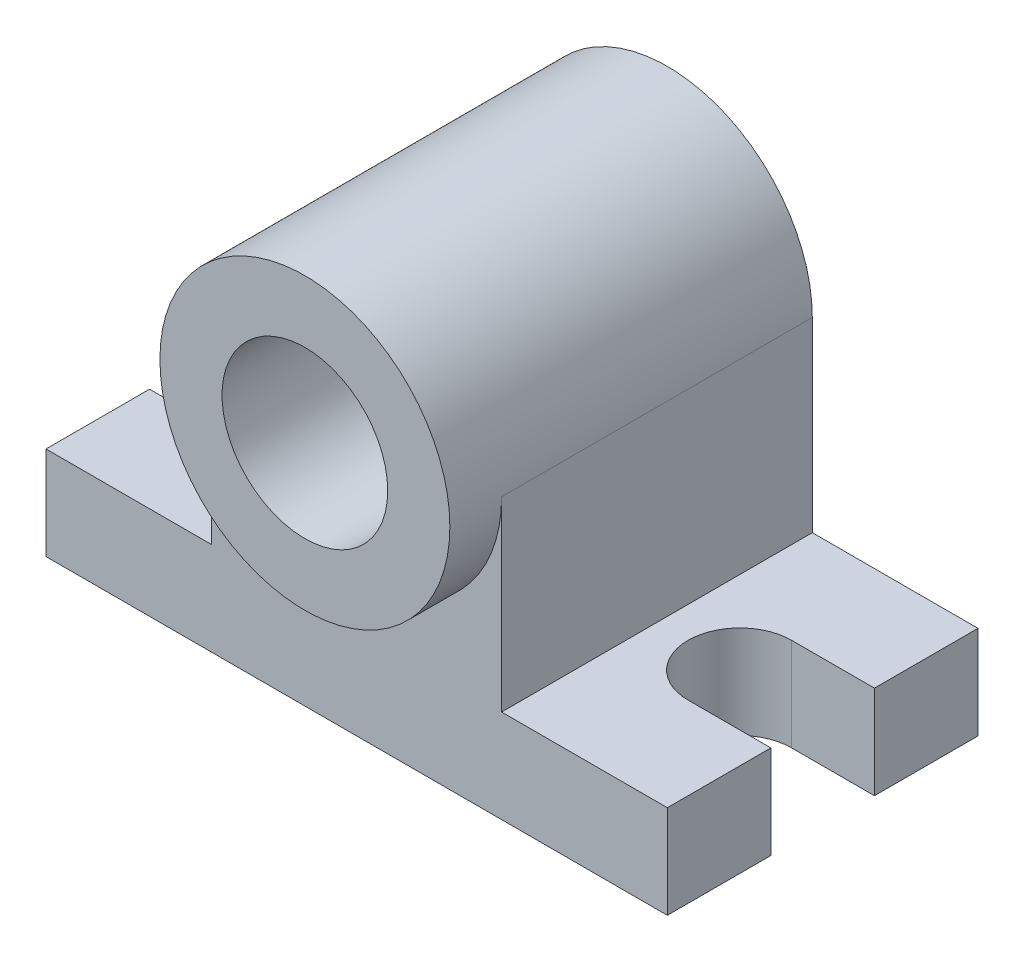
ISO-10303-21;
HEADER;
FILE_DESCRIPTION(('STEP AP214'),'2;1');
FILE_NAME('part.step','',(''),(''),'','','');
FILE_SCHEMA(('AUTOMOTIVE_DESIGN { 1 0 10303 214 1 1 1 1 }'));
ENDSEC;
DATA;
#1=APPLICATION_CONTEXT('core data for automotive mechanical design processes');
#2=APPLICATION_PROTOCOL_DEFINITION('international standard','automotive_design',2000,#1);
#3=PRODUCT_CONTEXT('',#1,'mechanical');
#4=PRODUCT('Part','Part','',(#3));
#5=PRODUCT_RELATED_PRODUCT_CATEGORY('part','',(#4));
#6=PRODUCT_DEFINITION_FORMATION('','',#4);
#7=PRODUCT_DEFINITION_CONTEXT('part definition',#1,'design');
#8=PRODUCT_DEFINITION('design','',#6,#7);
#9=PRODUCT_DEFINITION_SHAPE('','',#8);
#10=(LENGTH_UNIT() NAMED_UNIT(*) SI_UNIT(.MILLI.,.METRE.));
#11=(NAMED_UNIT(*) PLANE_ANGLE_UNIT() SI_UNIT($,.RADIAN.));
#12=(NAMED_UNIT(*) SI_UNIT($,.STERADIAN.) SOLID_ANGLE_UNIT());
#13=UNCERTAINTY_MEASURE_WITH_UNIT(LENGTH_MEASURE(1.E-05),#10,'distance_accuracy_value','');
#14=(GEOMETRIC_REPRESENTATION_CONTEXT(3) GLOBAL_UNCERTAINTY_ASSIGNED_CONTEXT((#13)) GLOBAL_UNIT_ASSIGNED_CONTEXT((#10,
#11,#12)) REPRESENTATION_CONTEXT('',''));
#15=CARTESIAN_POINT('',(0.,0.,0.));
#16=DIRECTION('',(0.,0.,1.));
#17=DIRECTION('',(1.,0.,0.));
#18=AXIS2_PLACEMENT_3D('',#15,#16,#17);
#19=CARTESIAN_POINT('',(30.0000000000001,0.,-30.));
#20=DIRECTION('',(1.,0.,0.));
#21=DIRECTION('',(0.,0.,-1.));
#22=AXIS2_PLACEMENT_3D('',#19,#20,#21);
#23=PLANE('',#22);
#24=DIRECTION('',(0.,1.,0.));
#25=VECTOR('',#24,1.);
#26=CARTESIAN_POINT('',(30.0000000000001,-27.,-20.));
#27=LINE('',#26,#25);
#28=CARTESIAN_POINT('',(30.0000000000001,-27.,-20.));
#29=VERTEX_POINT('',#28);
#30=CARTESIAN_POINT('',(30.0000000000001,-18.,-20.));
#31=VERTEX_POINT('',#30);
#32=EDGE_CURVE('E201',#29,#31,#27,.T.);
#33=ORIENTED_EDGE('',*,*,#32,.F.);
#34=DIRECTION('',(0.,0.,1.));
#35=VECTOR('',#34,1.);
#36=CARTESIAN_POINT('',(30.0000000000001,-27.,-30.));
#37=LINE('',#36,#35);
#38=CARTESIAN_POINT('',(30.0000000000001,-27.,-30.));
#39=VERTEX_POINT('',#38);
#40=EDGE_CURVE('E318',#39,#29,#37,.T.);
#41=ORIENTED_EDGE('',*,*,#40,.F.);
#42=DIRECTION('',(0.,1.,0.));
#43=VECTOR('',#42,1.);
#44=CARTESIAN_POINT('',(30.0000000000001,0.,-30.));
#45=LINE('',#44,#43);
#46=CARTESIAN_POINT('',(30.0000000000001,-18.,-30.));
#47=VERTEX_POINT('',#46);
#48=EDGE_CURVE('E267',#39,#47,#45,.T.);
#49=ORIENTED_EDGE('',*,*,#48,.T.);
#50=DIRECTION('',(0.,0.,1.));
#51=VECTOR('',#50,1.);
#52=CARTESIAN_POINT('',(30.0000000000001,-18.,-30.));
#53=LINE('',#52,#51);
#54=EDGE_CURVE('E313',#47,#31,#53,.T.);
#55=ORIENTED_EDGE('',*,*,#54,.T.);
#56=EDGE_LOOP('',(#33,#41,#49,#55));
#57=FACE_BOUND('',#56,.T.);
#58=ADVANCED_FACE('F47',(#57),#23,.T.);
#59=CARTESIAN_POINT('',(-30.,0.,-30.));
#60=DIRECTION('',(1.,0.,0.));
#61=DIRECTION('',(0.,1.,0.));
#62=AXIS2_PLACEMENT_3D('',#59,#60,#61);
#63=PLANE('',#62);
#64=DIRECTION('',(0.,0.,1.));
#65=VECTOR('',#64,1.);
#66=CARTESIAN_POINT('',(-29.9999999999999,-18.,-30.));
#67=LINE('',#66,#65);
#68=CARTESIAN_POINT('',(-29.9999999999999,-18.,-9.99999999999999));
#69=VERTEX_POINT('',#68);
#70=CARTESIAN_POINT('',(-29.9999999999999,-18.,0.));
#71=VERTEX_POINT('',#70);
#72=EDGE_CURVE('E330',#69,#71,#67,.T.);
#73=ORIENTED_EDGE('',*,*,#72,.F.);
#74=DIRECTION('',(0.,1.,0.));
#75=VECTOR('',#74,1.);
#76=CARTESIAN_POINT('',(-29.9999999999999,-27.,-9.99999999999999));
#77=LINE('',#76,#75);
#78=CARTESIAN_POINT('',(-29.9999999999999,-27.,-9.99999999999999));
#79=VERTEX_POINT('',#78);
#80=EDGE_CURVE('E214',#79,#69,#77,.T.);
#81=ORIENTED_EDGE('',*,*,#80,.F.);
#82=DIRECTION('',(0.,0.,1.));
#83=VECTOR('',#82,1.);
#84=CARTESIAN_POINT('',(-29.9999999999999,-27.,-30.));
#85=LINE('',#84,#83);
#86=CARTESIAN_POINT('',(-29.9999999999999,-27.,0.));
#87=VERTEX_POINT('',#86);
#88=EDGE_CURVE('E326',#79,#87,#85,.T.);
#89=ORIENTED_EDGE('',*,*,#88,.T.);
#90=DIRECTION('',(0.,1.,0.));
#91=VECTOR('',#90,1.);
#92=CARTESIAN_POINT('',(-30.,0.,0.));
#93=LINE('',#92,#91);
#94=EDGE_CURVE('E288',#87,#71,#93,.T.);
#95=ORIENTED_EDGE('',*,*,#94,.T.);
#96=EDGE_LOOP('',(#73,#81,#89,#95));
#97=FACE_BOUND('',#96,.T.);
#98=ADVANCED_FACE('F367',(#97),#63,.F.);
#99=CARTESIAN_POINT('',(0.,0.,-30.));
#100=DIRECTION('',(0.,0.,1.));
#101=DIRECTION('',(1.,0.,0.));
#102=AXIS2_PLACEMENT_3D('',#99,#100,#101);
#103=CYLINDRICAL_SURFACE('',#102,14.);
#104=DIRECTION('',(0.,0.,1.));
#105=VECTOR('',#104,1.);
#106=CARTESIAN_POINT('',(-14.,0.,-30.));
#107=LINE('',#106,#105);
#108=CARTESIAN_POINT('',(-14.,0.,-30.));
#109=VERTEX_POINT('',#108);
#110=CARTESIAN_POINT('',(-14.,0.,0.));
#111=VERTEX_POINT('',#110);
#112=EDGE_CURVE('E51',#109,#111,#107,.T.);
#113=ORIENTED_EDGE('',*,*,#112,.T.);
#114=CARTESIAN_POINT('',(0.,0.,0.));
#115=DIRECTION('',(0.,0.,1.));
#116=DIRECTION('',(1.,0.,0.));
#117=AXIS2_PLACEMENT_3D('',#114,#115,#116);
#118=CIRCLE('',#117,14.);
#119=CARTESIAN_POINT('',(14.,0.,0.));
#120=VERTEX_POINT('',#119);
#121=EDGE_CURVE('E11',#111,#120,#118,.T.);
#122=ORIENTED_EDGE('',*,*,#121,.T.);
#123=DIRECTION('',(0.,0.,1.));
#124=VECTOR('',#123,1.);
#125=CARTESIAN_POINT('',(14.,0.,-30.));
#126=LINE('',#125,#124);
#127=CARTESIAN_POINT('',(14.,0.,-30.));
#128=VERTEX_POINT('',#127);
#129=EDGE_CURVE('E57',#128,#120,#126,.T.);
#130=ORIENTED_EDGE('',*,*,#129,.F.);
#131=CARTESIAN_POINT('',(0.,0.,-30.));
#132=DIRECTION('',(0.,0.,1.));
#133=DIRECTION('',(1.,0.,0.));
#134=AXIS2_PLACEMENT_3D('',#131,#132,#133);
#135=CIRCLE('',#134,14.);
#136=EDGE_CURVE('E248',#128,#109,#135,.T.);
#137=ORIENTED_EDGE('',*,*,#136,.T.);
#138=EDGE_LOOP('',(#113,#122,#130,#137));
#139=FACE_BOUND('',#138,.T.);
#140=CARTESIAN_POINT('',(0.,0.,5.));
#141=DIRECTION('',(0.,0.,1.));
#142=DIRECTION('',(1.,0.,0.));
#143=AXIS2_PLACEMENT_3D('',#140,#141,#142);
#144=CIRCLE('',#143,14.);
#145=CARTESIAN_POINT('',(14.,0.,5.));
#146=VERTEX_POINT('',#145);
#147=EDGE_CURVE('E200',#146,#146,#144,.T.);
#148=ORIENTED_EDGE('',*,*,#147,.F.);
#149=EDGE_LOOP('',(#148));
#150=FACE_BOUND('',#149,.T.);
#151=ADVANCED_FACE('F49',(#139,#150),#103,.T.);
#152=CARTESIAN_POINT('',(14.,0.,-30.));
#153=DIRECTION('',(-1.,0.,0.));
#154=DIRECTION('',(0.,-1.,0.));
#155=AXIS2_PLACEMENT_3D('',#152,#153,#154);
#156=PLANE('',#155);
#157=DIRECTION('',(0.,-1.,0.));
#158=VECTOR('',#157,1.);
#159=CARTESIAN_POINT('',(14.,0.,0.));
#160=LINE('',#159,#158);
#161=CARTESIAN_POINT('',(14.,-18.,0.));
#162=VERTEX_POINT('',#161);
#163=EDGE_CURVE('E253',#120,#162,#160,.T.);
#164=ORIENTED_EDGE('',*,*,#163,.T.);
#165=DIRECTION('',(0.,0.,1.));
#166=VECTOR('',#165,1.);
#167=CARTESIAN_POINT('',(14.,-18.,-30.));
#168=LINE('',#167,#166);
#169=CARTESIAN_POINT('',(14.,-18.,-30.));
#170=VERTEX_POINT('',#169);
#171=EDGE_CURVE('E309',#170,#162,#168,.T.);
#172=ORIENTED_EDGE('',*,*,#171,.F.);
#173=DIRECTION('',(0.,-1.,0.));
#174=VECTOR('',#173,1.);
#175=CARTESIAN_POINT('',(14.,0.,-30.));
#176=LINE('',#175,#174);
#177=EDGE_CURVE('E274',#128,#170,#176,.T.);
#178=ORIENTED_EDGE('',*,*,#177,.F.);
#179=ORIENTED_EDGE('',*,*,#129,.T.);
#180=EDGE_LOOP('',(#164,#172,#178,#179));
#181=FACE_BOUND('',#180,.T.);
#182=ADVANCED_FACE('F352',(#181),#156,.F.);
#183=CARTESIAN_POINT('',(0.,-18.,-30.));
#184=DIRECTION('',(0.,-1.,0.));
#185=DIRECTION('',(1.,0.,0.));
#186=AXIS2_PLACEMENT_3D('',#183,#184,#185);
#187=PLANE('',#186);
#188=CARTESIAN_POINT('',(22.0000000000001,-18.,-15.));
#189=DIRECTION('',(0.,1.,0.));
#190=DIRECTION('',(-1.,0.,0.));
#191=AXIS2_PLACEMENT_3D('',#188,#189,#190);
#192=CIRCLE('',#191,5.);
#193=CARTESIAN_POINT('',(22.0000000000001,-18.,-20.));
#194=VERTEX_POINT('',#193);
#195=CARTESIAN_POINT('',(22.0000000000001,-18.,-10.));
#196=VERTEX_POINT('',#195);
#197=EDGE_CURVE('E170',#194,#196,#192,.T.);
#198=ORIENTED_EDGE('',*,*,#197,.F.);
#199=DIRECTION('',(-1.,0.,0.));
#200=VECTOR('',#199,1.);
#201=CARTESIAN_POINT('',(30.0000000000001,-18.,-20.));
#202=LINE('',#201,#200);
#203=EDGE_CURVE('E184',#31,#194,#202,.T.);
#204=ORIENTED_EDGE('',*,*,#203,.F.);
#205=ORIENTED_EDGE('',*,*,#54,.F.);
#206=DIRECTION('',(1.,0.,0.));
#207=VECTOR('',#206,1.);
#208=CARTESIAN_POINT('',(0.,-18.,-30.));
#209=LINE('',#208,#207);
#210=EDGE_CURVE('E271',#170,#47,#209,.T.);
#211=ORIENTED_EDGE('',*,*,#210,.F.);
#212=ORIENTED_EDGE('',*,*,#171,.T.);
#213=DIRECTION('',(1.,0.,0.));
#214=VECTOR('',#213,1.);
#215=CARTESIAN_POINT('',(0.,-18.,0.));
#216=LINE('',#215,#214);
#217=CARTESIAN_POINT('',(30.0000000000001,-18.,0.));
#218=VERTEX_POINT('',#217);
#219=EDGE_CURVE('E300',#162,#218,#216,.T.);
#220=ORIENTED_EDGE('',*,*,#219,.T.);
#221=CARTESIAN_POINT('',(30.0000000000001,-18.,-10.));
#222=VERTEX_POINT('',#221);
#223=EDGE_CURVE('E317',#222,#218,#53,.T.);
#224=ORIENTED_EDGE('',*,*,#223,.F.);
#225=DIRECTION('',(1.,0.,0.));
#226=VECTOR('',#225,1.);
#227=CARTESIAN_POINT('',(30.0000000000001,-18.,-10.));
#228=LINE('',#227,#226);
#229=EDGE_CURVE('E188',#196,#222,#228,.T.);
#230=ORIENTED_EDGE('',*,*,#229,.F.);
#231=EDGE_LOOP('',(#198,#204,#205,#211,#212,#220,#224,#230));
#232=FACE_BOUND('',#231,.T.);
#233=ADVANCED_FACE('F377',(#232),#187,.F.);
#234=DIRECTION('',(0.,1.,0.));
#235=VECTOR('',#234,1.);
#236=CARTESIAN_POINT('',(30.0000000000001,-27.,-10.));
#237=LINE('',#236,#235);
#238=CARTESIAN_POINT('',(30.0000000000001,-27.,-10.));
#239=VERTEX_POINT('',#238);
#240=EDGE_CURVE('E65',#239,#222,#237,.T.);
#241=ORIENTED_EDGE('',*,*,#240,.T.);
#242=ORIENTED_EDGE('',*,*,#223,.T.);
#243=DIRECTION('',(0.,1.,0.));
#244=VECTOR('',#243,1.);
#245=CARTESIAN_POINT('',(30.0000000000001,0.,0.));
#246=LINE('',#245,#244);
#247=CARTESIAN_POINT('',(30.0000000000001,-27.,0.));
#248=VERTEX_POINT('',#247);
#249=EDGE_CURVE('E296',#248,#218,#246,.T.);
#250=ORIENTED_EDGE('',*,*,#249,.F.);
#251=EDGE_CURVE('E321',#239,#248,#37,.T.);
#252=ORIENTED_EDGE('',*,*,#251,.F.);
#253=EDGE_LOOP('',(#241,#242,#250,#252));
#254=FACE_BOUND('',#253,.T.);
#255=ADVANCED_FACE('F373',(#254),#23,.T.);
#256=CARTESIAN_POINT('',(0.,-27.,-30.));
#257=DIRECTION('',(0.,-1.,0.));
#258=DIRECTION('',(0.,0.,-1.));
#259=AXIS2_PLACEMENT_3D('',#256,#257,#258);
#260=PLANE('',#259);
#261=DIRECTION('',(-1.,0.,0.));
#262=VECTOR('',#261,1.);
#263=CARTESIAN_POINT('',(30.0000000000001,-27.,-20.));
#264=LINE('',#263,#262);
#265=CARTESIAN_POINT('',(22.0000000000001,-27.,-20.));
#266=VERTEX_POINT('',#265);
#267=EDGE_CURVE('E173',#29,#266,#264,.T.);
#268=ORIENTED_EDGE('',*,*,#267,.T.);
#269=CARTESIAN_POINT('',(22.0000000000001,-27.,-15.));
#270=DIRECTION('',(0.,1.,0.));
#271=DIRECTION('',(-1.,0.,0.));
#272=AXIS2_PLACEMENT_3D('',#269,#270,#271);
#273=CIRCLE('',#272,5.);
#274=CARTESIAN_POINT('',(22.0000000000001,-27.,-10.));
#275=VERTEX_POINT('',#274);
#276=EDGE_CURVE('E167',#266,#275,#273,.T.);
#277=ORIENTED_EDGE('',*,*,#276,.T.);
#278=DIRECTION('',(1.,0.,0.));
#279=VECTOR('',#278,1.);
#280=CARTESIAN_POINT('',(30.0000000000001,-27.,-10.));
#281=LINE('',#280,#279);
#282=EDGE_CURVE('E175',#275,#239,#281,.T.);
#283=ORIENTED_EDGE('',*,*,#282,.T.);
#284=ORIENTED_EDGE('',*,*,#251,.T.);
#285=DIRECTION('',(1.,0.,0.));
#286=VECTOR('',#285,1.);
#287=CARTESIAN_POINT('',(0.,-27.,0.));
#288=LINE('',#287,#286);
#289=EDGE_CURVE('E292',#87,#248,#288,.T.);
#290=ORIENTED_EDGE('',*,*,#289,.F.);
#291=ORIENTED_EDGE('',*,*,#88,.F.);
#292=DIRECTION('',(1.,0.,0.));
#293=VECTOR('',#292,1.);
#294=CARTESIAN_POINT('',(-29.9999999999999,-27.,-9.99999999999999));
#295=LINE('',#294,#293);
#296=CARTESIAN_POINT('',(-21.9999999999999,-27.,-10.));
#297=VERTEX_POINT('',#296);
#298=EDGE_CURVE('E209',#79,#297,#295,.T.);
#299=ORIENTED_EDGE('',*,*,#298,.T.);
#300=CARTESIAN_POINT('',(-21.9999999999999,-27.,-15.));
#301=DIRECTION('',(0.,1.,0.));
#302=DIRECTION('',(1.,0.,0.));
#303=AXIS2_PLACEMENT_3D('',#300,#301,#302);
#304=CIRCLE('',#303,5.);
#305=CARTESIAN_POINT('',(-21.9999999999999,-27.,-20.));
#306=VERTEX_POINT('',#305);
#307=EDGE_CURVE('E225',#297,#306,#304,.T.);
#308=ORIENTED_EDGE('',*,*,#307,.T.);
#309=DIRECTION('',(-1.,0.,0.));
#310=VECTOR('',#309,1.);
#311=CARTESIAN_POINT('',(-29.9999999999999,-27.,-20.));
#312=LINE('',#311,#310);
#313=CARTESIAN_POINT('',(-29.9999999999999,-27.,-20.));
#314=VERTEX_POINT('',#313);
#315=EDGE_CURVE('E233',#306,#314,#312,.T.);
#316=ORIENTED_EDGE('',*,*,#315,.T.);
#317=CARTESIAN_POINT('',(-29.9999999999999,-27.,-30.));
#318=VERTEX_POINT('',#317);
#319=EDGE_CURVE('E322',#318,#314,#85,.T.);
#320=ORIENTED_EDGE('',*,*,#319,.F.);
#321=DIRECTION('',(1.,0.,0.));
#322=VECTOR('',#321,1.);
#323=CARTESIAN_POINT('',(0.,-27.,-30.));
#324=LINE('',#323,#322);
#325=EDGE_CURVE('E263',#318,#39,#324,.T.);
#326=ORIENTED_EDGE('',*,*,#325,.T.);
#327=ORIENTED_EDGE('',*,*,#40,.T.);
#328=EDGE_LOOP('',(#268,#277,#283,#284,#290,#291,#299,#308,#316,#320,#326,#327));
#329=FACE_BOUND('',#328,.T.);
#330=ADVANCED_FACE('F181',(#329),#260,.T.);
#331=ORIENTED_EDGE('',*,*,#319,.T.);
#332=DIRECTION('',(0.,1.,0.));
#333=VECTOR('',#332,1.);
#334=CARTESIAN_POINT('',(-29.9999999999999,-27.,-20.));
#335=LINE('',#334,#333);
#336=CARTESIAN_POINT('',(-29.9999999999999,-18.,-20.));
#337=VERTEX_POINT('',#336);
#338=EDGE_CURVE('E210',#314,#337,#335,.T.);
#339=ORIENTED_EDGE('',*,*,#338,.T.);
#340=CARTESIAN_POINT('',(-29.9999999999999,-18.,-30.));
#341=VERTEX_POINT('',#340);
#342=EDGE_CURVE('E327',#341,#337,#67,.T.);
#343=ORIENTED_EDGE('',*,*,#342,.F.);
#344=DIRECTION('',(0.,1.,0.));
#345=VECTOR('',#344,1.);
#346=CARTESIAN_POINT('',(-30.,0.,-30.));
#347=LINE('',#346,#345);
#348=EDGE_CURVE('E260',#318,#341,#347,.T.);
#349=ORIENTED_EDGE('',*,*,#348,.F.);
#350=EDGE_LOOP('',(#331,#339,#343,#349));
#351=FACE_BOUND('',#350,.T.);
#352=ADVANCED_FACE('F384',(#351),#63,.F.);
#353=CARTESIAN_POINT('',(0.,-18.,-30.));
#354=DIRECTION('',(0.,-1.,0.));
#355=DIRECTION('',(1.,0.,0.));
#356=AXIS2_PLACEMENT_3D('',#353,#354,#355);
#357=PLANE('',#356);
#358=CARTESIAN_POINT('',(-21.9999999999999,-18.,-15.));
#359=DIRECTION('',(0.,1.,0.));
#360=DIRECTION('',(1.,0.,0.));
#361=AXIS2_PLACEMENT_3D('',#358,#359,#360);
#362=CIRCLE('',#361,5.);
#363=CARTESIAN_POINT('',(-21.9999999999999,-18.,-10.));
#364=VERTEX_POINT('',#363);
#365=CARTESIAN_POINT('',(-21.9999999999999,-18.,-20.));
#366=VERTEX_POINT('',#365);
#367=EDGE_CURVE('E73',#364,#366,#362,.T.);
#368=ORIENTED_EDGE('',*,*,#367,.F.);
#369=DIRECTION('',(1.,0.,0.));
#370=VECTOR('',#369,1.);
#371=CARTESIAN_POINT('',(-29.9999999999999,-18.,-9.99999999999999));
#372=LINE('',#371,#370);
#373=EDGE_CURVE('E220',#69,#364,#372,.T.);
#374=ORIENTED_EDGE('',*,*,#373,.F.);
#375=ORIENTED_EDGE('',*,*,#72,.T.);
#376=DIRECTION('',(1.,0.,0.));
#377=VECTOR('',#376,1.);
#378=CARTESIAN_POINT('',(0.,-18.,0.));
#379=LINE('',#378,#377);
#380=CARTESIAN_POINT('',(-14.,-18.,0.));
#381=VERTEX_POINT('',#380);
#382=EDGE_CURVE('E284',#71,#381,#379,.T.);
#383=ORIENTED_EDGE('',*,*,#382,.T.);
#384=DIRECTION('',(0.,0.,1.));
#385=VECTOR('',#384,1.);
#386=CARTESIAN_POINT('',(-14.,-18.,-30.));
#387=LINE('',#386,#385);
#388=CARTESIAN_POINT('',(-14.,-18.,-30.));
#389=VERTEX_POINT('',#388);
#390=EDGE_CURVE('E331',#389,#381,#387,.T.);
#391=ORIENTED_EDGE('',*,*,#390,.F.);
#392=DIRECTION('',(1.,0.,0.));
#393=VECTOR('',#392,1.);
#394=CARTESIAN_POINT('',(0.,-18.,-30.));
#395=LINE('',#394,#393);
#396=EDGE_CURVE('E257',#341,#389,#395,.T.);
#397=ORIENTED_EDGE('',*,*,#396,.F.);
#398=ORIENTED_EDGE('',*,*,#342,.T.);
#399=DIRECTION('',(-1.,0.,0.));
#400=VECTOR('',#399,1.);
#401=CARTESIAN_POINT('',(-29.9999999999999,-18.,-20.));
#402=LINE('',#401,#400);
#403=EDGE_CURVE('E224',#366,#337,#402,.T.);
#404=ORIENTED_EDGE('',*,*,#403,.F.);
#405=EDGE_LOOP('',(#368,#374,#375,#383,#391,#397,#398,#404));
#406=FACE_BOUND('',#405,.T.);
#407=ADVANCED_FACE('F362',(#406),#357,.F.);
#408=CARTESIAN_POINT('',(-14.,0.,-30.));
#409=DIRECTION('',(-1.,0.,0.));
#410=DIRECTION('',(0.,-1.,0.));
#411=AXIS2_PLACEMENT_3D('',#408,#409,#410);
#412=PLANE('',#411);
#413=DIRECTION('',(0.,-1.,0.));
#414=VECTOR('',#413,1.);
#415=CARTESIAN_POINT('',(-14.,0.,0.));
#416=LINE('',#415,#414);
#417=EDGE_CURVE('E246',#111,#381,#416,.T.);
#418=ORIENTED_EDGE('',*,*,#417,.F.);
#419=ORIENTED_EDGE('',*,*,#112,.F.);
#420=DIRECTION('',(0.,-1.,0.));
#421=VECTOR('',#420,1.);
#422=CARTESIAN_POINT('',(-14.,0.,-30.));
#423=LINE('',#422,#421);
#424=EDGE_CURVE('E252',#109,#389,#423,.T.);
#425=ORIENTED_EDGE('',*,*,#424,.T.);
#426=ORIENTED_EDGE('',*,*,#390,.T.);
#427=EDGE_LOOP('',(#418,#419,#425,#426));
#428=FACE_BOUND('',#427,.T.);
#429=ADVANCED_FACE('F343',(#428),#412,.T.);
#430=CARTESIAN_POINT('',(0.,0.,-30.));
#431=DIRECTION('',(0.,0.,1.));
#432=DIRECTION('',(1.,0.,0.));
#433=AXIS2_PLACEMENT_3D('',#430,#431,#432);
#434=CYLINDRICAL_SURFACE('',#433,8.);
#435=CARTESIAN_POINT('',(0.,0.,-30.));
#436=DIRECTION('',(0.,0.,1.));
#437=DIRECTION('',(1.,0.,0.));
#438=AXIS2_PLACEMENT_3D('',#435,#436,#437);
#439=CIRCLE('',#438,8.);
#440=CARTESIAN_POINT('',(8.,0.,-30.));
#441=VERTEX_POINT('',#440);
#442=EDGE_CURVE('E277',#441,#441,#439,.T.);
#443=ORIENTED_EDGE('',*,*,#442,.F.);
#444=EDGE_LOOP('',(#443));
#445=FACE_BOUND('',#444,.T.);
#446=CARTESIAN_POINT('',(0.,0.,5.));
#447=DIRECTION('',(0.,0.,1.));
#448=DIRECTION('',(1.,0.,0.));
#449=AXIS2_PLACEMENT_3D('',#446,#447,#448);
#450=CIRCLE('',#449,8.);
#451=CARTESIAN_POINT('',(8.,0.,5.));
#452=VERTEX_POINT('',#451);
#453=EDGE_CURVE('E243',#452,#452,#450,.T.);
#454=ORIENTED_EDGE('',*,*,#453,.T.);
#455=EDGE_LOOP('',(#454));
#456=FACE_BOUND('',#455,.T.);
#457=ADVANCED_FACE('F422',(#445,#456),#434,.F.);
#458=CARTESIAN_POINT('',(0.,0.,-30.));
#459=DIRECTION('',(0.,0.,1.));
#460=DIRECTION('',(1.,0.,0.));
#461=AXIS2_PLACEMENT_3D('',#458,#459,#460);
#462=PLANE('',#461);
#463=ORIENTED_EDGE('',*,*,#136,.F.);
#464=ORIENTED_EDGE('',*,*,#177,.T.);
#465=ORIENTED_EDGE('',*,*,#210,.T.);
#466=ORIENTED_EDGE('',*,*,#48,.F.);
#467=ORIENTED_EDGE('',*,*,#325,.F.);
#468=ORIENTED_EDGE('',*,*,#348,.T.);
#469=ORIENTED_EDGE('',*,*,#396,.T.);
#470=ORIENTED_EDGE('',*,*,#424,.F.);
#471=EDGE_LOOP('',(#463,#464,#465,#466,#467,#468,#469,#470));
#472=FACE_BOUND('',#471,.T.);
#473=ORIENTED_EDGE('',*,*,#442,.T.);
#474=EDGE_LOOP('',(#473));
#475=FACE_BOUND('',#474,.T.);
#476=ADVANCED_FACE('F355',(#472,#475),#462,.F.);
#477=CARTESIAN_POINT('',(0.,0.,0.));
#478=DIRECTION('',(0.,0.,1.));
#479=DIRECTION('',(1.,0.,0.));
#480=AXIS2_PLACEMENT_3D('',#477,#478,#479);
#481=PLANE('',#480);
#482=ORIENTED_EDGE('',*,*,#121,.F.);
#483=ORIENTED_EDGE('',*,*,#417,.T.);
#484=ORIENTED_EDGE('',*,*,#382,.F.);
#485=ORIENTED_EDGE('',*,*,#94,.F.);
#486=ORIENTED_EDGE('',*,*,#289,.T.);
#487=ORIENTED_EDGE('',*,*,#249,.T.);
#488=ORIENTED_EDGE('',*,*,#219,.F.);
#489=ORIENTED_EDGE('',*,*,#163,.F.);
#490=EDGE_LOOP('',(#482,#483,#484,#485,#486,#487,#488,#489));
#491=FACE_BOUND('',#490,.T.);
#492=ADVANCED_FACE('F346',(#491),#481,.T.);
#493=CARTESIAN_POINT('',(0.,0.,5.));
#494=DIRECTION('',(0.,0.,1.));
#495=DIRECTION('',(1.,0.,0.));
#496=AXIS2_PLACEMENT_3D('',#493,#494,#495);
#497=PLANE('',#496);
#498=ORIENTED_EDGE('',*,*,#147,.T.);
#499=EDGE_LOOP('',(#498));
#500=FACE_BOUND('',#499,.T.);
#501=ORIENTED_EDGE('',*,*,#453,.F.);
#502=EDGE_LOOP('',(#501));
#503=FACE_BOUND('',#502,.T.);
#504=ADVANCED_FACE('F399',(#500,#503),#497,.T.);
#505=CARTESIAN_POINT('',(-21.9999999999999,-27.,-15.));
#506=DIRECTION('',(0.,1.,0.));
#507=DIRECTION('',(-1.,0.,0.));
#508=AXIS2_PLACEMENT_3D('',#505,#506,#507);
#509=CYLINDRICAL_SURFACE('',#508,5.);
#510=ORIENTED_EDGE('',*,*,#367,.T.);
#511=DIRECTION('',(0.,1.,0.));
#512=VECTOR('',#511,1.);
#513=CARTESIAN_POINT('',(-21.9999999999999,-27.,-20.));
#514=LINE('',#513,#512);
#515=EDGE_CURVE('E206',#306,#366,#514,.T.);
#516=ORIENTED_EDGE('',*,*,#515,.F.);
#517=ORIENTED_EDGE('',*,*,#307,.F.);
#518=DIRECTION('',(0.,1.,0.));
#519=VECTOR('',#518,1.);
#520=CARTESIAN_POINT('',(-21.9999999999999,-27.,-10.));
#521=LINE('',#520,#519);
#522=EDGE_CURVE('E217',#297,#364,#521,.T.);
#523=ORIENTED_EDGE('',*,*,#522,.T.);
#524=EDGE_LOOP('',(#510,#516,#517,#523));
#525=FACE_BOUND('',#524,.T.);
#526=ADVANCED_FACE('F389',(#525),#509,.F.);
#527=CARTESIAN_POINT('',(-29.9999999999999,-27.,-9.99999999999999));
#528=DIRECTION('',(0.,0.,1.));
#529=DIRECTION('',(1.,0.,0.));
#530=AXIS2_PLACEMENT_3D('',#527,#528,#529);
#531=PLANE('',#530);
#532=ORIENTED_EDGE('',*,*,#373,.T.);
#533=ORIENTED_EDGE('',*,*,#522,.F.);
#534=ORIENTED_EDGE('',*,*,#298,.F.);
#535=ORIENTED_EDGE('',*,*,#80,.T.);
#536=EDGE_LOOP('',(#532,#533,#534,#535));
#537=FACE_BOUND('',#536,.T.);
#538=ADVANCED_FACE('F391',(#537),#531,.F.);
#539=CARTESIAN_POINT('',(-29.9999999999999,-27.,-20.));
#540=DIRECTION('',(0.,0.,-1.));
#541=DIRECTION('',(-1.,0.,0.));
#542=AXIS2_PLACEMENT_3D('',#539,#540,#541);
#543=PLANE('',#542);
#544=ORIENTED_EDGE('',*,*,#403,.T.);
#545=ORIENTED_EDGE('',*,*,#338,.F.);
#546=ORIENTED_EDGE('',*,*,#315,.F.);
#547=ORIENTED_EDGE('',*,*,#515,.T.);
#548=EDGE_LOOP('',(#544,#545,#546,#547));
#549=FACE_BOUND('',#548,.T.);
#550=ADVANCED_FACE('F387',(#549),#543,.F.);
#551=CARTESIAN_POINT('',(22.0000000000001,-27.,-15.));
#552=DIRECTION('',(0.,1.,0.));
#553=DIRECTION('',(-1.,0.,0.));
#554=AXIS2_PLACEMENT_3D('',#551,#552,#553);
#555=CYLINDRICAL_SURFACE('',#554,5.);
#556=ORIENTED_EDGE('',*,*,#197,.T.);
#557=DIRECTION('',(0.,1.,0.));
#558=VECTOR('',#557,1.);
#559=CARTESIAN_POINT('',(22.0000000000001,-27.,-10.));
#560=LINE('',#559,#558);
#561=EDGE_CURVE('E164',#275,#196,#560,.T.);
#562=ORIENTED_EDGE('',*,*,#561,.F.);
#563=ORIENTED_EDGE('',*,*,#276,.F.);
#564=DIRECTION('',(0.,1.,0.));
#565=VECTOR('',#564,1.);
#566=CARTESIAN_POINT('',(22.0000000000001,-27.,-20.));
#567=LINE('',#566,#565);
#568=EDGE_CURVE('E197',#266,#194,#567,.T.);
#569=ORIENTED_EDGE('',*,*,#568,.T.);
#570=EDGE_LOOP('',(#556,#562,#563,#569));
#571=FACE_BOUND('',#570,.T.);
#572=ADVANCED_FACE('F165',(#571),#555,.F.);
#573=CARTESIAN_POINT('',(30.0000000000001,-27.,-20.));
#574=DIRECTION('',(0.,0.,-1.));
#575=DIRECTION('',(-1.,0.,0.));
#576=AXIS2_PLACEMENT_3D('',#573,#574,#575);
#577=PLANE('',#576);
#578=ORIENTED_EDGE('',*,*,#203,.T.);
#579=ORIENTED_EDGE('',*,*,#568,.F.);
#580=ORIENTED_EDGE('',*,*,#267,.F.);
#581=ORIENTED_EDGE('',*,*,#32,.T.);
#582=EDGE_LOOP('',(#578,#579,#580,#581));
#583=FACE_BOUND('',#582,.T.);
#584=ADVANCED_FACE('F549',(#583),#577,.F.);
#585=CARTESIAN_POINT('',(30.0000000000001,-27.,-10.));
#586=DIRECTION('',(0.,0.,1.));
#587=DIRECTION('',(1.,0.,0.));
#588=AXIS2_PLACEMENT_3D('',#585,#586,#587);
#589=PLANE('',#588);
#590=ORIENTED_EDGE('',*,*,#229,.T.);
#591=ORIENTED_EDGE('',*,*,#240,.F.);
#592=ORIENTED_EDGE('',*,*,#282,.F.);
#593=ORIENTED_EDGE('',*,*,#561,.T.);
#594=EDGE_LOOP('',(#590,#591,#592,#593));
#595=FACE_BOUND('',#594,.T.);
#596=ADVANCED_FACE('F176',(#595),#589,.F.);
#597=CLOSED_SHELL('',(#58,#98,#151,#182,#233,#255,#330,#352,#407,#429,#457,#476,#492,#504,#526,
#538,#550,#572,#584,#596));
#598=MANIFOLD_SOLID_BREP('B2',#597);
#599=ADVANCED_BREP_SHAPE_REPRESENTATION('',(#18,#598),#14);
#600=SHAPE_DEFINITION_REPRESENTATION(#9,#599);
ENDSEC;
END-ISO-10303-21;
